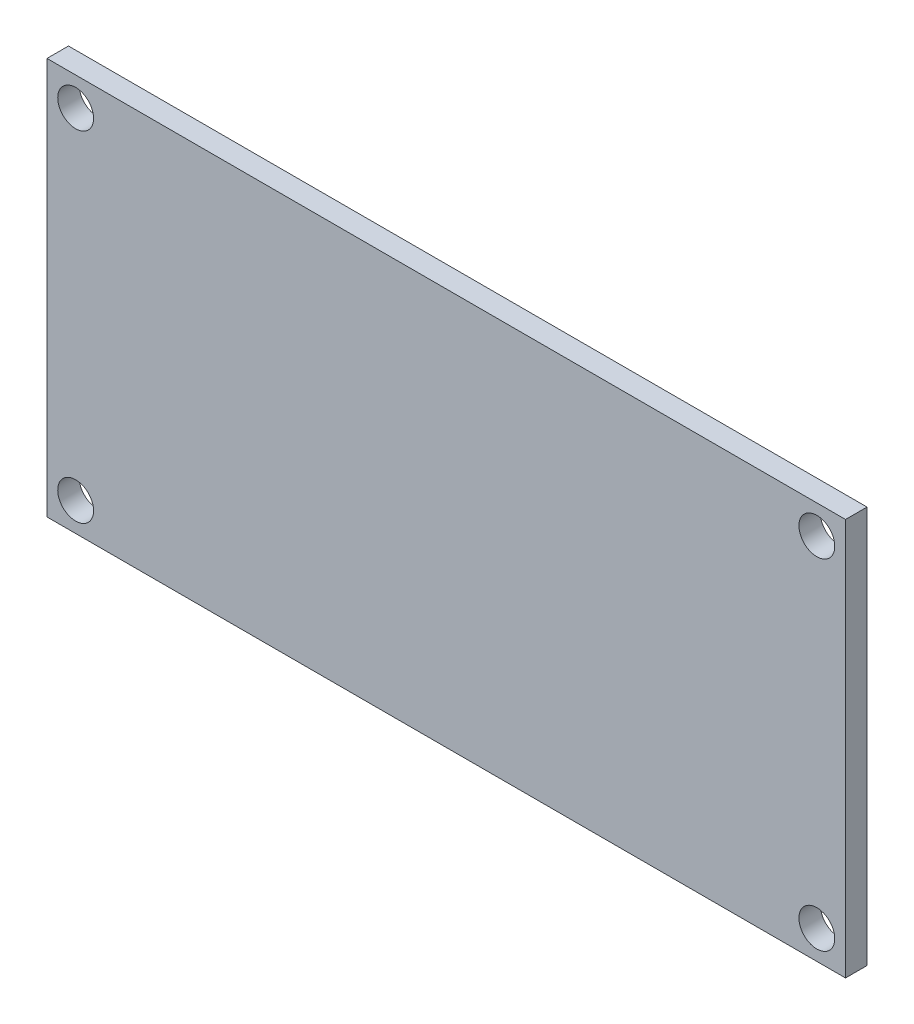
ISO-10303-21;
HEADER;
FILE_DESCRIPTION(('STEP AP214'),'2;1');
FILE_NAME('part.step','',(''),(''),'','','');
FILE_SCHEMA(('AUTOMOTIVE_DESIGN { 1 0 10303 214 1 1 1 1 }'));
ENDSEC;
DATA;
#1=APPLICATION_CONTEXT('core data for automotive mechanical design processes');
#2=APPLICATION_PROTOCOL_DEFINITION('international standard','automotive_design',2000,#1);
#3=PRODUCT_CONTEXT('',#1,'mechanical');
#4=PRODUCT('Part','Part','',(#3));
#5=PRODUCT_RELATED_PRODUCT_CATEGORY('part','',(#4));
#6=PRODUCT_DEFINITION_FORMATION('','',#4);
#7=PRODUCT_DEFINITION_CONTEXT('part definition',#1,'design');
#8=PRODUCT_DEFINITION('design','',#6,#7);
#9=PRODUCT_DEFINITION_SHAPE('','',#8);
#10=(LENGTH_UNIT() NAMED_UNIT(*) SI_UNIT(.MILLI.,.METRE.));
#11=(NAMED_UNIT(*) PLANE_ANGLE_UNIT() SI_UNIT($,.RADIAN.));
#12=(NAMED_UNIT(*) SI_UNIT($,.STERADIAN.) SOLID_ANGLE_UNIT());
#13=UNCERTAINTY_MEASURE_WITH_UNIT(LENGTH_MEASURE(1.E-05),#10,'distance_accuracy_value','');
#14=(GEOMETRIC_REPRESENTATION_CONTEXT(3) GLOBAL_UNCERTAINTY_ASSIGNED_CONTEXT((#13)) GLOBAL_UNIT_ASSIGNED_CONTEXT((#10,
#11,#12)) REPRESENTATION_CONTEXT('',''));
#15=CARTESIAN_POINT('',(0.,0.,0.));
#16=DIRECTION('',(0.,0.,1.));
#17=DIRECTION('',(1.,0.,0.));
#18=AXIS2_PLACEMENT_3D('',#15,#16,#17);
#19=CARTESIAN_POINT('',(-55.7,27.7,3.));
#20=DIRECTION('',(1.,0.,0.));
#21=DIRECTION('',(0.,0.,-1.));
#22=AXIS2_PLACEMENT_3D('',#19,#20,#21);
#23=PLANE('',#22);
#24=DIRECTION('',(0.,-1.,0.));
#25=VECTOR('',#24,1.);
#26=CARTESIAN_POINT('',(-55.7,27.7,0.));
#27=LINE('',#26,#25);
#28=CARTESIAN_POINT('',(-55.7,27.7,0.));
#29=VERTEX_POINT('',#28);
#30=CARTESIAN_POINT('',(-55.7,-27.7,0.));
#31=VERTEX_POINT('',#30);
#32=EDGE_CURVE('E101',#29,#31,#27,.T.);
#33=ORIENTED_EDGE('',*,*,#32,.T.);
#34=DIRECTION('',(0.,0.,-1.));
#35=VECTOR('',#34,1.);
#36=CARTESIAN_POINT('',(-55.7,-27.7,3.));
#37=LINE('',#36,#35);
#38=CARTESIAN_POINT('',(-55.7,-27.7,3.));
#39=VERTEX_POINT('',#38);
#40=EDGE_CURVE('E11',#39,#31,#37,.T.);
#41=ORIENTED_EDGE('',*,*,#40,.F.);
#42=DIRECTION('',(0.,-1.,0.));
#43=VECTOR('',#42,1.);
#44=CARTESIAN_POINT('',(-55.7,27.7,3.));
#45=LINE('',#44,#43);
#46=CARTESIAN_POINT('',(-55.7,27.7,3.));
#47=VERTEX_POINT('',#46);
#48=EDGE_CURVE('E89',#47,#39,#45,.T.);
#49=ORIENTED_EDGE('',*,*,#48,.F.);
#50=DIRECTION('',(0.,0.,-1.));
#51=VECTOR('',#50,1.);
#52=CARTESIAN_POINT('',(-55.7,27.7,3.));
#53=LINE('',#52,#51);
#54=EDGE_CURVE('E97',#47,#29,#53,.T.);
#55=ORIENTED_EDGE('',*,*,#54,.T.);
#56=EDGE_LOOP('',(#33,#41,#49,#55));
#57=FACE_BOUND('',#56,.T.);
#58=ADVANCED_FACE('F38',(#57),#23,.F.);
#59=CARTESIAN_POINT('',(-55.7,-27.7,3.));
#60=DIRECTION('',(0.,1.,0.));
#61=DIRECTION('',(-1.,0.,0.));
#62=AXIS2_PLACEMENT_3D('',#59,#60,#61);
#63=PLANE('',#62);
#64=DIRECTION('',(1.,0.,0.));
#65=VECTOR('',#64,1.);
#66=CARTESIAN_POINT('',(-55.7,-27.7,0.));
#67=LINE('',#66,#65);
#68=CARTESIAN_POINT('',(55.7,-27.7,0.));
#69=VERTEX_POINT('',#68);
#70=EDGE_CURVE('E93',#31,#69,#67,.T.);
#71=ORIENTED_EDGE('',*,*,#70,.T.);
#72=DIRECTION('',(0.,0.,-1.));
#73=VECTOR('',#72,1.);
#74=CARTESIAN_POINT('',(55.7,-27.7,3.));
#75=LINE('',#74,#73);
#76=CARTESIAN_POINT('',(55.7,-27.7,3.));
#77=VERTEX_POINT('',#76);
#78=EDGE_CURVE('E46',#77,#69,#75,.T.);
#79=ORIENTED_EDGE('',*,*,#78,.F.);
#80=DIRECTION('',(1.,0.,0.));
#81=VECTOR('',#80,1.);
#82=CARTESIAN_POINT('',(-55.7,-27.7,3.));
#83=LINE('',#82,#81);
#84=EDGE_CURVE('E84',#39,#77,#83,.T.);
#85=ORIENTED_EDGE('',*,*,#84,.F.);
#86=ORIENTED_EDGE('',*,*,#40,.T.);
#87=EDGE_LOOP('',(#71,#79,#85,#86));
#88=FACE_BOUND('',#87,.T.);
#89=ADVANCED_FACE('F92',(#88),#63,.F.);
#90=CARTESIAN_POINT('',(55.7,27.7,3.));
#91=DIRECTION('',(-1.,0.,0.));
#92=DIRECTION('',(0.,0.,1.));
#93=AXIS2_PLACEMENT_3D('',#90,#91,#92);
#94=PLANE('',#93);
#95=DIRECTION('',(0.,1.,0.));
#96=VECTOR('',#95,1.);
#97=CARTESIAN_POINT('',(55.7,27.7,0.));
#98=LINE('',#97,#96);
#99=CARTESIAN_POINT('',(55.7,27.7,0.));
#100=VERTEX_POINT('',#99);
#101=EDGE_CURVE('E71',#69,#100,#98,.T.);
#102=ORIENTED_EDGE('',*,*,#101,.T.);
#103=DIRECTION('',(0.,0.,-1.));
#104=VECTOR('',#103,1.);
#105=CARTESIAN_POINT('',(55.7,27.7,3.));
#106=LINE('',#105,#104);
#107=CARTESIAN_POINT('',(55.7,27.7,3.));
#108=VERTEX_POINT('',#107);
#109=EDGE_CURVE('E94',#108,#100,#106,.T.);
#110=ORIENTED_EDGE('',*,*,#109,.F.);
#111=DIRECTION('',(0.,1.,0.));
#112=VECTOR('',#111,1.);
#113=CARTESIAN_POINT('',(55.7,27.7,3.));
#114=LINE('',#113,#112);
#115=EDGE_CURVE('E87',#77,#108,#114,.T.);
#116=ORIENTED_EDGE('',*,*,#115,.F.);
#117=ORIENTED_EDGE('',*,*,#78,.T.);
#118=EDGE_LOOP('',(#102,#110,#116,#117));
#119=FACE_BOUND('',#118,.T.);
#120=ADVANCED_FACE('F95',(#119),#94,.F.);
#121=CARTESIAN_POINT('',(-55.7,27.7,3.));
#122=DIRECTION('',(0.,-1.,0.));
#123=DIRECTION('',(0.,0.,-1.));
#124=AXIS2_PLACEMENT_3D('',#121,#122,#123);
#125=PLANE('',#124);
#126=DIRECTION('',(-1.,0.,0.));
#127=VECTOR('',#126,1.);
#128=CARTESIAN_POINT('',(-55.7,27.7,0.));
#129=LINE('',#128,#127);
#130=EDGE_CURVE('E77',#100,#29,#129,.T.);
#131=ORIENTED_EDGE('',*,*,#130,.T.);
#132=ORIENTED_EDGE('',*,*,#54,.F.);
#133=DIRECTION('',(-1.,0.,0.));
#134=VECTOR('',#133,1.);
#135=CARTESIAN_POINT('',(-55.7,27.7,3.));
#136=LINE('',#135,#134);
#137=EDGE_CURVE('E54',#108,#47,#136,.T.);
#138=ORIENTED_EDGE('',*,*,#137,.F.);
#139=ORIENTED_EDGE('',*,*,#109,.T.);
#140=EDGE_LOOP('',(#131,#132,#138,#139));
#141=FACE_BOUND('',#140,.T.);
#142=ADVANCED_FACE('F109',(#141),#125,.F.);
#143=CARTESIAN_POINT('',(0.,0.,3.));
#144=DIRECTION('',(0.,0.,1.));
#145=DIRECTION('',(1.,0.,0.));
#146=AXIS2_PLACEMENT_3D('',#143,#144,#145);
#147=PLANE('',#146);
#148=CARTESIAN_POINT('',(-51.7,23.7,3.));
#149=DIRECTION('',(0.,0.,-1.));
#150=DIRECTION('',(-1.,0.,0.));
#151=AXIS2_PLACEMENT_3D('',#148,#149,#150);
#152=CIRCLE('',#151,2.5);
#153=CARTESIAN_POINT('',(-54.2,23.7,3.));
#154=VERTEX_POINT('',#153);
#155=EDGE_CURVE('E124',#154,#154,#152,.T.);
#156=ORIENTED_EDGE('',*,*,#155,.T.);
#157=EDGE_LOOP('',(#156));
#158=FACE_BOUND('',#157,.T.);
#159=CARTESIAN_POINT('',(-51.7,-23.7,3.));
#160=DIRECTION('',(0.,0.,-1.));
#161=DIRECTION('',(-1.,0.,0.));
#162=AXIS2_PLACEMENT_3D('',#159,#160,#161);
#163=CIRCLE('',#162,2.50000000000001);
#164=CARTESIAN_POINT('',(-54.2,-23.7,3.));
#165=VERTEX_POINT('',#164);
#166=EDGE_CURVE('E130',#165,#165,#163,.T.);
#167=ORIENTED_EDGE('',*,*,#166,.T.);
#168=EDGE_LOOP('',(#167));
#169=FACE_BOUND('',#168,.T.);
#170=CARTESIAN_POINT('',(51.7,-23.7,3.));
#171=DIRECTION('',(0.,0.,-1.));
#172=DIRECTION('',(-1.,0.,0.));
#173=AXIS2_PLACEMENT_3D('',#170,#171,#172);
#174=CIRCLE('',#173,2.49999999999999);
#175=CARTESIAN_POINT('',(49.2,-23.7,3.));
#176=VERTEX_POINT('',#175);
#177=EDGE_CURVE('E118',#176,#176,#174,.T.);
#178=ORIENTED_EDGE('',*,*,#177,.T.);
#179=EDGE_LOOP('',(#178));
#180=FACE_BOUND('',#179,.T.);
#181=CARTESIAN_POINT('',(51.7,23.7,3.));
#182=DIRECTION('',(0.,0.,-1.));
#183=DIRECTION('',(-1.,0.,0.));
#184=AXIS2_PLACEMENT_3D('',#181,#182,#183);
#185=CIRCLE('',#184,2.5);
#186=CARTESIAN_POINT('',(49.2,23.7,3.));
#187=VERTEX_POINT('',#186);
#188=EDGE_CURVE('E104',#187,#187,#185,.T.);
#189=ORIENTED_EDGE('',*,*,#188,.T.);
#190=EDGE_LOOP('',(#189));
#191=FACE_BOUND('',#190,.T.);
#192=ORIENTED_EDGE('',*,*,#48,.T.);
#193=ORIENTED_EDGE('',*,*,#84,.T.);
#194=ORIENTED_EDGE('',*,*,#115,.T.);
#195=ORIENTED_EDGE('',*,*,#137,.T.);
#196=EDGE_LOOP('',(#192,#193,#194,#195));
#197=FACE_BOUND('',#196,.T.);
#198=ADVANCED_FACE('F85',(#158,#169,#180,#191,#197),#147,.T.);
#199=CARTESIAN_POINT('',(0.,0.,0.));
#200=DIRECTION('',(0.,0.,1.));
#201=DIRECTION('',(1.,0.,0.));
#202=AXIS2_PLACEMENT_3D('',#199,#200,#201);
#203=PLANE('',#202);
#204=CARTESIAN_POINT('',(-51.7,23.7,0.));
#205=DIRECTION('',(0.,0.,-1.));
#206=DIRECTION('',(-1.,0.,0.));
#207=AXIS2_PLACEMENT_3D('',#204,#205,#206);
#208=CIRCLE('',#207,2.5);
#209=CARTESIAN_POINT('',(-54.2,23.7,0.));
#210=VERTEX_POINT('',#209);
#211=EDGE_CURVE('E121',#210,#210,#208,.T.);
#212=ORIENTED_EDGE('',*,*,#211,.F.);
#213=EDGE_LOOP('',(#212));
#214=FACE_BOUND('',#213,.T.);
#215=CARTESIAN_POINT('',(-51.7,-23.7,0.));
#216=DIRECTION('',(0.,0.,-1.));
#217=DIRECTION('',(-1.,0.,0.));
#218=AXIS2_PLACEMENT_3D('',#215,#216,#217);
#219=CIRCLE('',#218,2.50000000000001);
#220=CARTESIAN_POINT('',(-54.2,-23.7,0.));
#221=VERTEX_POINT('',#220);
#222=EDGE_CURVE('E127',#221,#221,#219,.T.);
#223=ORIENTED_EDGE('',*,*,#222,.F.);
#224=EDGE_LOOP('',(#223));
#225=FACE_BOUND('',#224,.T.);
#226=CARTESIAN_POINT('',(51.7,-23.7,0.));
#227=DIRECTION('',(0.,0.,-1.));
#228=DIRECTION('',(-1.,0.,0.));
#229=AXIS2_PLACEMENT_3D('',#226,#227,#228);
#230=CIRCLE('',#229,2.49999999999999);
#231=CARTESIAN_POINT('',(49.2,-23.7,0.));
#232=VERTEX_POINT('',#231);
#233=EDGE_CURVE('E133',#232,#232,#230,.T.);
#234=ORIENTED_EDGE('',*,*,#233,.F.);
#235=EDGE_LOOP('',(#234));
#236=FACE_BOUND('',#235,.T.);
#237=CARTESIAN_POINT('',(51.7,23.7,0.));
#238=DIRECTION('',(0.,0.,-1.));
#239=DIRECTION('',(-1.,0.,0.));
#240=AXIS2_PLACEMENT_3D('',#237,#238,#239);
#241=CIRCLE('',#240,2.5);
#242=CARTESIAN_POINT('',(49.2,23.7,0.));
#243=VERTEX_POINT('',#242);
#244=EDGE_CURVE('E115',#243,#243,#241,.T.);
#245=ORIENTED_EDGE('',*,*,#244,.F.);
#246=EDGE_LOOP('',(#245));
#247=FACE_BOUND('',#246,.T.);
#248=ORIENTED_EDGE('',*,*,#32,.F.);
#249=ORIENTED_EDGE('',*,*,#130,.F.);
#250=ORIENTED_EDGE('',*,*,#101,.F.);
#251=ORIENTED_EDGE('',*,*,#70,.F.);
#252=EDGE_LOOP('',(#248,#249,#250,#251));
#253=FACE_BOUND('',#252,.T.);
#254=ADVANCED_FACE('F112',(#214,#225,#236,#247,#253),#203,.F.);
#255=CARTESIAN_POINT('',(51.7,23.7,3.));
#256=DIRECTION('',(0.,0.,-1.));
#257=DIRECTION('',(-1.,0.,0.));
#258=AXIS2_PLACEMENT_3D('',#255,#256,#257);
#259=CYLINDRICAL_SURFACE('',#258,2.5);
#260=ORIENTED_EDGE('',*,*,#188,.F.);
#261=EDGE_LOOP('',(#260));
#262=FACE_BOUND('',#261,.T.);
#263=ORIENTED_EDGE('',*,*,#244,.T.);
#264=EDGE_LOOP('',(#263));
#265=FACE_BOUND('',#264,.T.);
#266=ADVANCED_FACE('F145',(#262,#265),#259,.F.);
#267=CARTESIAN_POINT('',(51.7,-23.7,3.));
#268=DIRECTION('',(0.,0.,-1.));
#269=DIRECTION('',(-1.,0.,0.));
#270=AXIS2_PLACEMENT_3D('',#267,#268,#269);
#271=CYLINDRICAL_SURFACE('',#270,2.49999999999999);
#272=ORIENTED_EDGE('',*,*,#177,.F.);
#273=EDGE_LOOP('',(#272));
#274=FACE_BOUND('',#273,.T.);
#275=ORIENTED_EDGE('',*,*,#233,.T.);
#276=EDGE_LOOP('',(#275));
#277=FACE_BOUND('',#276,.T.);
#278=ADVANCED_FACE('F141',(#274,#277),#271,.F.);
#279=CARTESIAN_POINT('',(-51.7,-23.7,3.));
#280=DIRECTION('',(0.,0.,-1.));
#281=DIRECTION('',(-1.,0.,0.));
#282=AXIS2_PLACEMENT_3D('',#279,#280,#281);
#283=CYLINDRICAL_SURFACE('',#282,2.50000000000001);
#284=ORIENTED_EDGE('',*,*,#166,.F.);
#285=EDGE_LOOP('',(#284));
#286=FACE_BOUND('',#285,.T.);
#287=ORIENTED_EDGE('',*,*,#222,.T.);
#288=EDGE_LOOP('',(#287));
#289=FACE_BOUND('',#288,.T.);
#290=ADVANCED_FACE('F144',(#286,#289),#283,.F.);
#291=CARTESIAN_POINT('',(-51.7,23.7,3.));
#292=DIRECTION('',(0.,0.,-1.));
#293=DIRECTION('',(-1.,0.,0.));
#294=AXIS2_PLACEMENT_3D('',#291,#292,#293);
#295=CYLINDRICAL_SURFACE('',#294,2.5);
#296=ORIENTED_EDGE('',*,*,#155,.F.);
#297=EDGE_LOOP('',(#296));
#298=FACE_BOUND('',#297,.T.);
#299=ORIENTED_EDGE('',*,*,#211,.T.);
#300=EDGE_LOOP('',(#299));
#301=FACE_BOUND('',#300,.T.);
#302=ADVANCED_FACE('F183',(#298,#301),#295,.F.);
#303=CLOSED_SHELL('',(#58,#89,#120,#142,#198,#254,#266,#278,#290,#302));
#304=MANIFOLD_SOLID_BREP('B2',#303);
#305=ADVANCED_BREP_SHAPE_REPRESENTATION('',(#18,#304),#14);
#306=SHAPE_DEFINITION_REPRESENTATION(#9,#305);
ENDSEC;
END-ISO-10303-21;
